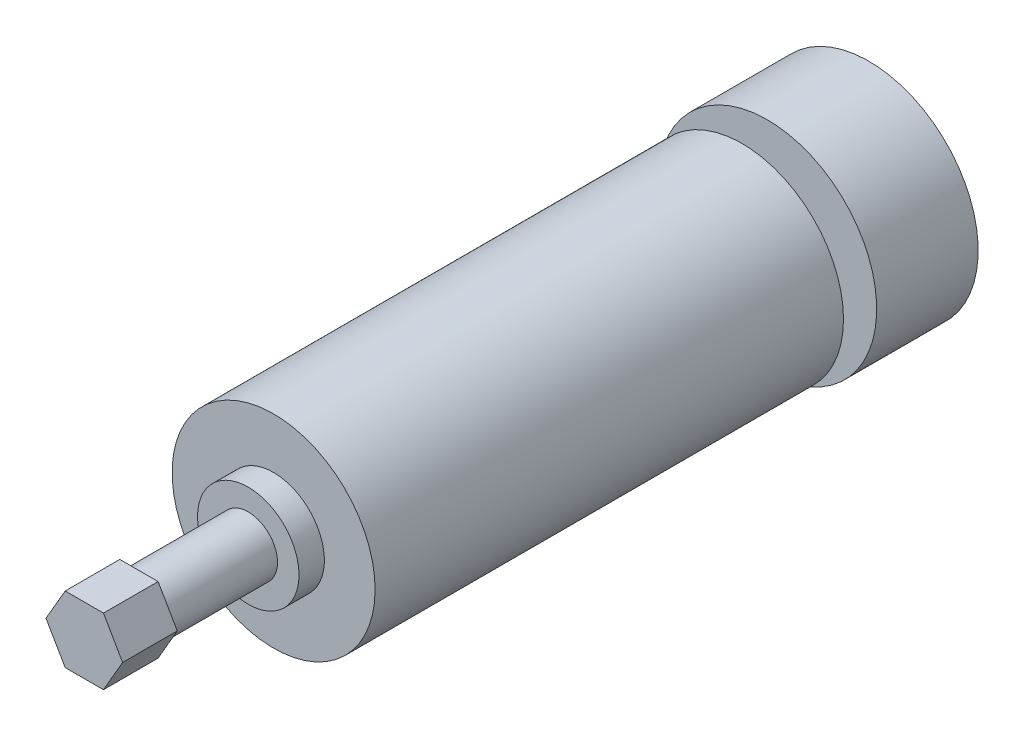
ISO-10303-21;
HEADER;
FILE_DESCRIPTION(('STEP AP214'),'2;1');
FILE_NAME('part.step','',(''),(''),'','','');
FILE_SCHEMA(('AUTOMOTIVE_DESIGN { 1 0 10303 214 1 1 1 1 }'));
ENDSEC;
DATA;
#1=APPLICATION_CONTEXT('core data for automotive mechanical design processes');
#2=APPLICATION_PROTOCOL_DEFINITION('international standard','automotive_design',2000,#1);
#3=PRODUCT_CONTEXT('',#1,'mechanical');
#4=PRODUCT('Part','Part','',(#3));
#5=PRODUCT_RELATED_PRODUCT_CATEGORY('part','',(#4));
#6=PRODUCT_DEFINITION_FORMATION('','',#4);
#7=PRODUCT_DEFINITION_CONTEXT('part definition',#1,'design');
#8=PRODUCT_DEFINITION('design','',#6,#7);
#9=PRODUCT_DEFINITION_SHAPE('','',#8);
#10=(LENGTH_UNIT() NAMED_UNIT(*) SI_UNIT(.MILLI.,.METRE.));
#11=(NAMED_UNIT(*) PLANE_ANGLE_UNIT() SI_UNIT($,.RADIAN.));
#12=(NAMED_UNIT(*) SI_UNIT($,.STERADIAN.) SOLID_ANGLE_UNIT());
#13=UNCERTAINTY_MEASURE_WITH_UNIT(LENGTH_MEASURE(1.E-05),#10,'distance_accuracy_value','');
#14=(GEOMETRIC_REPRESENTATION_CONTEXT(3) GLOBAL_UNCERTAINTY_ASSIGNED_CONTEXT((#13)) GLOBAL_UNIT_ASSIGNED_CONTEXT((#10,
#11,#12)) REPRESENTATION_CONTEXT('',''));
#15=CARTESIAN_POINT('',(0.,0.,0.));
#16=DIRECTION('',(0.,0.,1.));
#17=DIRECTION('',(1.,0.,0.));
#18=AXIS2_PLACEMENT_3D('',#15,#16,#17);
#19=CARTESIAN_POINT('',(0.,0.,120.));
#20=DIRECTION('',(0.,0.,-1.));
#21=DIRECTION('',(-1.,0.,0.));
#22=AXIS2_PLACEMENT_3D('',#19,#20,#21);
#23=CYLINDRICAL_SURFACE('',#22,26.);
#24=CARTESIAN_POINT('',(0.,0.,120.));
#25=DIRECTION('',(0.,0.,1.));
#26=DIRECTION('',(1.,0.,0.));
#27=AXIS2_PLACEMENT_3D('',#24,#25,#26);
#28=CIRCLE('',#27,26.);
#29=CARTESIAN_POINT('',(26.,0.,120.));
#30=VERTEX_POINT('',#29);
#31=EDGE_CURVE('E154',#30,#30,#28,.T.);
#32=ORIENTED_EDGE('',*,*,#31,.F.);
#33=EDGE_LOOP('',(#32));
#34=FACE_BOUND('',#33,.T.);
#35=CARTESIAN_POINT('',(0.,0.,0.));
#36=DIRECTION('',(0.,0.,1.));
#37=DIRECTION('',(1.,0.,0.));
#38=AXIS2_PLACEMENT_3D('',#35,#36,#37);
#39=CIRCLE('',#38,26.);
#40=CARTESIAN_POINT('',(26.,0.,0.));
#41=VERTEX_POINT('',#40);
#42=EDGE_CURVE('E37',#41,#41,#39,.T.);
#43=ORIENTED_EDGE('',*,*,#42,.T.);
#44=EDGE_LOOP('',(#43));
#45=FACE_BOUND('',#44,.T.);
#46=ADVANCED_FACE('F34',(#34,#45),#23,.T.);
#47=CARTESIAN_POINT('',(0.,0.,120.));
#48=DIRECTION('',(0.,0.,1.));
#49=DIRECTION('',(1.,0.,0.));
#50=AXIS2_PLACEMENT_3D('',#47,#48,#49);
#51=PLANE('',#50);
#52=CARTESIAN_POINT('',(0.,0.,120.));
#53=DIRECTION('',(0.,0.,1.));
#54=DIRECTION('',(1.,0.,0.));
#55=AXIS2_PLACEMENT_3D('',#52,#53,#54);
#56=CIRCLE('',#55,13.);
#57=CARTESIAN_POINT('',(-13.,0.,120.));
#58=VERTEX_POINT('',#57);
#59=EDGE_CURVE('E150',#58,#58,#56,.T.);
#60=ORIENTED_EDGE('',*,*,#59,.F.);
#61=EDGE_LOOP('',(#60));
#62=FACE_BOUND('',#61,.T.);
#63=ORIENTED_EDGE('',*,*,#31,.T.);
#64=EDGE_LOOP('',(#63));
#65=FACE_BOUND('',#64,.T.);
#66=ADVANCED_FACE('F165',(#62,#65),#51,.T.);
#67=CARTESIAN_POINT('',(0.,0.,0.));
#68=DIRECTION('',(0.,0.,1.));
#69=DIRECTION('',(1.,0.,0.));
#70=AXIS2_PLACEMENT_3D('',#67,#68,#69);
#71=PLANE('',#70);
#72=CARTESIAN_POINT('',(0.,0.,0.));
#73=DIRECTION('',(0.,0.,-1.));
#74=DIRECTION('',(-1.,0.,0.));
#75=AXIS2_PLACEMENT_3D('',#72,#73,#74);
#76=CIRCLE('',#75,13.);
#77=CARTESIAN_POINT('',(13.,0.,0.));
#78=VERTEX_POINT('',#77);
#79=EDGE_CURVE('E43',#78,#78,#76,.T.);
#80=ORIENTED_EDGE('',*,*,#79,.F.);
#81=EDGE_LOOP('',(#80));
#82=FACE_BOUND('',#81,.T.);
#83=ORIENTED_EDGE('',*,*,#42,.F.);
#84=EDGE_LOOP('',(#83));
#85=FACE_BOUND('',#84,.T.);
#86=ADVANCED_FACE('F162',(#82,#85),#71,.F.);
#87=CARTESIAN_POINT('',(0.,0.,126.5));
#88=DIRECTION('',(0.,0.,-1.));
#89=DIRECTION('',(-1.,0.,0.));
#90=AXIS2_PLACEMENT_3D('',#87,#88,#89);
#91=CYLINDRICAL_SURFACE('',#90,13.);
#92=CARTESIAN_POINT('',(0.,0.,126.5));
#93=DIRECTION('',(0.,0.,1.));
#94=DIRECTION('',(1.,0.,0.));
#95=AXIS2_PLACEMENT_3D('',#92,#93,#94);
#96=CIRCLE('',#95,13.);
#97=CARTESIAN_POINT('',(-13.,0.,126.5));
#98=VERTEX_POINT('',#97);
#99=EDGE_CURVE('E147',#98,#98,#96,.T.);
#100=CARTESIAN_POINT('',(-13.,0.,126.5));
#101=CARTESIAN_POINT('',(-13.,0.,126.432291666667));
#102=CARTESIAN_POINT('',(-13.,0.,126.364583333333));
#103=CARTESIAN_POINT('',(-13.,0.,126.229166666667));
#104=CARTESIAN_POINT('',(-13.,0.,126.161458333333));
#105=CARTESIAN_POINT('',(-13.,0.,126.026041666667));
#106=CARTESIAN_POINT('',(-13.,0.,125.958333333333));
#107=CARTESIAN_POINT('',(-13.,0.,125.822916666667));
#108=CARTESIAN_POINT('',(-13.,0.,125.755208333333));
#109=CARTESIAN_POINT('',(-13.,0.,125.619791666667));
#110=CARTESIAN_POINT('',(-13.,0.,125.552083333333));
#111=CARTESIAN_POINT('',(-13.,0.,125.416666666667));
#112=CARTESIAN_POINT('',(-13.,0.,125.348958333333));
#113=CARTESIAN_POINT('',(-13.,0.,125.213541666667));
#114=CARTESIAN_POINT('',(-13.,0.,125.145833333333));
#115=CARTESIAN_POINT('',(-13.,0.,125.010416666667));
#116=CARTESIAN_POINT('',(-13.,0.,124.942708333333));
#117=CARTESIAN_POINT('',(-13.,0.,124.807291666667));
#118=CARTESIAN_POINT('',(-13.,0.,124.739583333333));
#119=CARTESIAN_POINT('',(-13.,0.,124.604166666667));
#120=CARTESIAN_POINT('',(-13.,0.,124.536458333333));
#121=CARTESIAN_POINT('',(-13.,0.,124.401041666667));
#122=CARTESIAN_POINT('',(-13.,0.,124.333333333333));
#123=CARTESIAN_POINT('',(-13.,0.,124.197916666667));
#124=CARTESIAN_POINT('',(-13.,0.,124.130208333333));
#125=CARTESIAN_POINT('',(-13.,0.,123.994791666667));
#126=CARTESIAN_POINT('',(-13.,0.,123.927083333333));
#127=CARTESIAN_POINT('',(-13.,0.,123.791666666667));
#128=CARTESIAN_POINT('',(-13.,0.,123.723958333333));
#129=CARTESIAN_POINT('',(-13.,0.,123.588541666667));
#130=CARTESIAN_POINT('',(-13.,0.,123.520833333333));
#131=CARTESIAN_POINT('',(-13.,0.,123.385416666667));
#132=CARTESIAN_POINT('',(-13.,0.,123.317708333333));
#133=CARTESIAN_POINT('',(-13.,0.,123.182291666667));
#134=CARTESIAN_POINT('',(-13.,0.,123.114583333333));
#135=CARTESIAN_POINT('',(-13.,0.,122.979166666667));
#136=CARTESIAN_POINT('',(-13.,0.,122.911458333333));
#137=CARTESIAN_POINT('',(-13.,0.,122.776041666667));
#138=CARTESIAN_POINT('',(-13.,0.,122.708333333333));
#139=CARTESIAN_POINT('',(-13.,0.,122.572916666667));
#140=CARTESIAN_POINT('',(-13.,0.,122.505208333333));
#141=CARTESIAN_POINT('',(-13.,0.,122.369791666667));
#142=CARTESIAN_POINT('',(-13.,0.,122.302083333333));
#143=CARTESIAN_POINT('',(-13.,0.,122.166666666667));
#144=CARTESIAN_POINT('',(-13.,0.,122.098958333333));
#145=CARTESIAN_POINT('',(-13.,0.,121.963541666667));
#146=CARTESIAN_POINT('',(-13.,0.,121.895833333333));
#147=CARTESIAN_POINT('',(-13.,0.,121.760416666667));
#148=CARTESIAN_POINT('',(-13.,0.,121.692708333333));
#149=CARTESIAN_POINT('',(-13.,0.,121.557291666667));
#150=CARTESIAN_POINT('',(-13.,0.,121.489583333333));
#151=CARTESIAN_POINT('',(-13.,0.,121.354166666667));
#152=CARTESIAN_POINT('',(-13.,0.,121.286458333333));
#153=CARTESIAN_POINT('',(-13.,0.,121.151041666667));
#154=CARTESIAN_POINT('',(-13.,0.,121.083333333333));
#155=CARTESIAN_POINT('',(-13.,0.,120.947916666667));
#156=CARTESIAN_POINT('',(-13.,0.,120.880208333333));
#157=CARTESIAN_POINT('',(-13.,0.,120.744791666667));
#158=CARTESIAN_POINT('',(-13.,0.,120.677083333333));
#159=CARTESIAN_POINT('',(-13.,0.,120.541666666667));
#160=CARTESIAN_POINT('',(-13.,0.,120.473958333333));
#161=CARTESIAN_POINT('',(-13.,0.,120.338541666667));
#162=CARTESIAN_POINT('',(-13.,0.,120.270833333333));
#163=CARTESIAN_POINT('',(-13.,0.,120.135416666667));
#164=CARTESIAN_POINT('',(-13.,0.,120.067708333333));
#165=CARTESIAN_POINT('',(-13.,0.,120.));
#166=B_SPLINE_CURVE_WITH_KNOTS('',3,(#100,#101,#102,#103,#104,#105,#106,#107,#108,#109,#110,
#111,#112,#113,#114,#115,#116,#117,#118,#119,#120,#121,#122,#123,#124,#125,#126,#127,#128,#129,
#130,#131,#132,#133,#134,#135,#136,#137,#138,#139,#140,#141,#142,#143,#144,#145,#146,#147,#148,
#149,#150,#151,#152,#153,#154,#155,#156,#157,#158,#159,#160,#161,#162,#163,#164,#165),
.UNSPECIFIED.,.F.,.F.,(4,2,2,2,2,2,2,2,2,2,2,2,2,2,2,2,2,2,2,2,2,2,2,2,2,2,2,2,2,2,2,2,4),(0.,
0.203124999999998,0.406249999999997,0.609374999999995,0.812499999999994,1.01562499999999,
1.21874999999999,1.42187499999999,1.62499999999999,1.82812499999999,2.03124999999998,
2.23437499999998,2.43749999999998,2.64062499999998,2.84374999999999,3.04687499999999,
3.24999999999999,3.45312499999999,3.65624999999999,3.85937499999998,4.06249999999998,
4.26562499999998,4.46874999999998,4.67187499999999,4.87499999999999,5.07812499999999,
5.28124999999999,5.48437499999999,5.68749999999998,5.89062499999998,6.09374999999998,
6.29687499999998,6.49999999999999),.UNSPECIFIED.);
#167=EDGE_CURVE('BSEAM164',#98,#58,#166,.T.);
#168=ORIENTED_EDGE('',*,*,#99,.F.);
#169=ORIENTED_EDGE('',*,*,#59,.T.);
#170=ORIENTED_EDGE('',*,*,#167,.T.);
#171=ORIENTED_EDGE('',*,*,#167,.F.);
#172=EDGE_LOOP('',(#168,#170,#169,#171));
#173=FACE_BOUND('',#172,.T.);
#174=ADVANCED_FACE('F164',(#173),#91,.T.);
#175=CARTESIAN_POINT('',(0.,0.,126.5));
#176=DIRECTION('',(0.,0.,1.));
#177=DIRECTION('',(1.,0.,0.));
#178=AXIS2_PLACEMENT_3D('',#175,#176,#177);
#179=PLANE('',#178);
#180=CARTESIAN_POINT('',(0.,0.,126.5));
#181=DIRECTION('',(0.,0.,1.));
#182=DIRECTION('',(1.,0.,0.));
#183=AXIS2_PLACEMENT_3D('',#180,#181,#182);
#184=CIRCLE('',#183,7.5);
#185=CARTESIAN_POINT('',(7.5,0.,126.5));
#186=VERTEX_POINT('',#185);
#187=EDGE_CURVE('E11',#186,#186,#184,.T.);
#188=ORIENTED_EDGE('',*,*,#187,.F.);
#189=EDGE_LOOP('',(#188));
#190=FACE_BOUND('',#189,.T.);
#191=ORIENTED_EDGE('',*,*,#99,.T.);
#192=EDGE_LOOP('',(#191));
#193=FACE_BOUND('',#192,.T.);
#194=ADVANCED_FACE('F171',(#190,#193),#179,.T.);
#195=CARTESIAN_POINT('',(0.,0.,-6.5));
#196=DIRECTION('',(0.,0.,1.));
#197=DIRECTION('',(1.,0.,0.));
#198=AXIS2_PLACEMENT_3D('',#195,#196,#197);
#199=CYLINDRICAL_SURFACE('',#198,13.);
#200=CARTESIAN_POINT('',(0.,0.,-6.5));
#201=DIRECTION('',(0.,0.,-1.));
#202=DIRECTION('',(-1.,0.,0.));
#203=AXIS2_PLACEMENT_3D('',#200,#201,#202);
#204=CIRCLE('',#203,13.);
#205=CARTESIAN_POINT('',(13.,0.,-6.5));
#206=VERTEX_POINT('',#205);
#207=EDGE_CURVE('E143',#206,#206,#204,.T.);
#208=CARTESIAN_POINT('',(13.,0.,-6.5));
#209=CARTESIAN_POINT('',(13.,0.,-6.43229166666667));
#210=CARTESIAN_POINT('',(13.,0.,-6.36458333333333));
#211=CARTESIAN_POINT('',(13.,0.,-6.22916666666667));
#212=CARTESIAN_POINT('',(13.,0.,-6.16145833333333));
#213=CARTESIAN_POINT('',(13.,0.,-6.02604166666667));
#214=CARTESIAN_POINT('',(13.,0.,-5.95833333333333));
#215=CARTESIAN_POINT('',(13.,0.,-5.82291666666667));
#216=CARTESIAN_POINT('',(13.,0.,-5.75520833333333));
#217=CARTESIAN_POINT('',(13.,0.,-5.61979166666667));
#218=CARTESIAN_POINT('',(13.,0.,-5.55208333333333));
#219=CARTESIAN_POINT('',(13.,0.,-5.41666666666667));
#220=CARTESIAN_POINT('',(13.,0.,-5.34895833333333));
#221=CARTESIAN_POINT('',(13.,0.,-5.21354166666667));
#222=CARTESIAN_POINT('',(13.,0.,-5.14583333333333));
#223=CARTESIAN_POINT('',(13.,0.,-5.01041666666667));
#224=CARTESIAN_POINT('',(13.,0.,-4.94270833333333));
#225=CARTESIAN_POINT('',(13.,0.,-4.80729166666667));
#226=CARTESIAN_POINT('',(13.,0.,-4.73958333333333));
#227=CARTESIAN_POINT('',(13.,0.,-4.60416666666667));
#228=CARTESIAN_POINT('',(13.,0.,-4.53645833333333));
#229=CARTESIAN_POINT('',(13.,0.,-4.40104166666667));
#230=CARTESIAN_POINT('',(13.,0.,-4.33333333333333));
#231=CARTESIAN_POINT('',(13.,0.,-4.19791666666667));
#232=CARTESIAN_POINT('',(13.,0.,-4.13020833333333));
#233=CARTESIAN_POINT('',(13.,0.,-3.99479166666667));
#234=CARTESIAN_POINT('',(13.,0.,-3.92708333333333));
#235=CARTESIAN_POINT('',(13.,0.,-3.79166666666667));
#236=CARTESIAN_POINT('',(13.,0.,-3.72395833333333));
#237=CARTESIAN_POINT('',(13.,0.,-3.58854166666667));
#238=CARTESIAN_POINT('',(13.,0.,-3.52083333333333));
#239=CARTESIAN_POINT('',(13.,0.,-3.38541666666667));
#240=CARTESIAN_POINT('',(13.,0.,-3.31770833333333));
#241=CARTESIAN_POINT('',(13.,0.,-3.18229166666667));
#242=CARTESIAN_POINT('',(13.,0.,-3.11458333333333));
#243=CARTESIAN_POINT('',(13.,0.,-2.97916666666667));
#244=CARTESIAN_POINT('',(13.,0.,-2.91145833333333));
#245=CARTESIAN_POINT('',(13.,0.,-2.77604166666667));
#246=CARTESIAN_POINT('',(13.,0.,-2.70833333333333));
#247=CARTESIAN_POINT('',(13.,0.,-2.57291666666667));
#248=CARTESIAN_POINT('',(13.,0.,-2.50520833333333));
#249=CARTESIAN_POINT('',(13.,0.,-2.36979166666667));
#250=CARTESIAN_POINT('',(13.,0.,-2.30208333333333));
#251=CARTESIAN_POINT('',(13.,0.,-2.16666666666667));
#252=CARTESIAN_POINT('',(13.,0.,-2.09895833333333));
#253=CARTESIAN_POINT('',(13.,0.,-1.96354166666667));
#254=CARTESIAN_POINT('',(13.,0.,-1.89583333333333));
#255=CARTESIAN_POINT('',(13.,0.,-1.76041666666667));
#256=CARTESIAN_POINT('',(13.,0.,-1.69270833333333));
#257=CARTESIAN_POINT('',(13.,0.,-1.55729166666667));
#258=CARTESIAN_POINT('',(13.,0.,-1.48958333333333));
#259=CARTESIAN_POINT('',(13.,0.,-1.35416666666667));
#260=CARTESIAN_POINT('',(13.,0.,-1.28645833333333));
#261=CARTESIAN_POINT('',(13.,0.,-1.15104166666667));
#262=CARTESIAN_POINT('',(13.,0.,-1.08333333333333));
#263=CARTESIAN_POINT('',(13.,0.,-0.947916666666667));
#264=CARTESIAN_POINT('',(13.,0.,-0.880208333333333));
#265=CARTESIAN_POINT('',(13.,0.,-0.744791666666667));
#266=CARTESIAN_POINT('',(13.,0.,-0.677083333333333));
#267=CARTESIAN_POINT('',(13.,0.,-0.541666666666667));
#268=CARTESIAN_POINT('',(13.,0.,-0.473958333333333));
#269=CARTESIAN_POINT('',(13.,0.,-0.338541666666667));
#270=CARTESIAN_POINT('',(13.,0.,-0.270833333333334));
#271=CARTESIAN_POINT('',(13.,0.,-0.135416666666667));
#272=CARTESIAN_POINT('',(13.,0.,-0.0677083333333334));
#273=CARTESIAN_POINT('',(13.,0.,0.));
#274=B_SPLINE_CURVE_WITH_KNOTS('',3,(#208,#209,#210,#211,#212,#213,#214,#215,#216,#217,#218,
#219,#220,#221,#222,#223,#224,#225,#226,#227,#228,#229,#230,#231,#232,#233,#234,#235,#236,#237,
#238,#239,#240,#241,#242,#243,#244,#245,#246,#247,#248,#249,#250,#251,#252,#253,#254,#255,#256,
#257,#258,#259,#260,#261,#262,#263,#264,#265,#266,#267,#268,#269,#270,#271,#272,#273),
.UNSPECIFIED.,.F.,.F.,(4,2,2,2,2,2,2,2,2,2,2,2,2,2,2,2,2,2,2,2,2,2,2,2,2,2,2,2,2,2,2,2,4),(0.,
0.203125,0.40625,0.609375000000001,0.812500000000001,1.015625,1.21875,1.421875,1.625,1.828125,
2.03125,2.234375,2.4375,2.640625,2.84375,3.046875,3.25,3.453125,3.65625,3.859375,4.0625,
4.265625,4.46875,4.671875,4.875,5.078125,5.28125,5.484375,5.6875,5.890625,6.09375,6.296875,6.5),.UNSPECIFIED.);
#275=EDGE_CURVE('BSEAM202',#206,#78,#274,.T.);
#276=ORIENTED_EDGE('',*,*,#207,.F.);
#277=ORIENTED_EDGE('',*,*,#79,.T.);
#278=ORIENTED_EDGE('',*,*,#275,.T.);
#279=ORIENTED_EDGE('',*,*,#275,.F.);
#280=EDGE_LOOP('',(#276,#278,#277,#279));
#281=FACE_BOUND('',#280,.T.);
#282=ADVANCED_FACE('F202',(#281),#199,.T.);
#283=CARTESIAN_POINT('',(0.,0.,154.5));
#284=DIRECTION('',(0.,0.,-1.));
#285=DIRECTION('',(-1.,0.,0.));
#286=AXIS2_PLACEMENT_3D('',#283,#284,#285);
#287=CYLINDRICAL_SURFACE('',#286,7.5);
#288=CARTESIAN_POINT('',(0.,0.,154.5));
#289=DIRECTION('',(0.,0.,1.));
#290=DIRECTION('',(1.,0.,0.));
#291=AXIS2_PLACEMENT_3D('',#288,#289,#290);
#292=CIRCLE('',#291,7.5);
#293=CARTESIAN_POINT('',(7.5,0.,154.5));
#294=VERTEX_POINT('',#293);
#295=EDGE_CURVE('E141',#294,#294,#292,.T.);
#296=ORIENTED_EDGE('',*,*,#295,.F.);
#297=EDGE_LOOP('',(#296));
#298=FACE_BOUND('',#297,.T.);
#299=ORIENTED_EDGE('',*,*,#187,.T.);
#300=EDGE_LOOP('',(#299));
#301=FACE_BOUND('',#300,.T.);
#302=ADVANCED_FACE('F207',(#298,#301),#287,.T.);
#303=CARTESIAN_POINT('',(4.90747728811182,-8.50000000000001,168.5));
#304=DIRECTION('',(-0.866025403784439,0.5,0.));
#305=DIRECTION('',(-0.5,-0.866025403784439,0.));
#306=AXIS2_PLACEMENT_3D('',#303,#304,#305);
#307=PLANE('',#306);
#308=DIRECTION('',(0.5,0.866025403784439,0.));
#309=VECTOR('',#308,1.);
#310=CARTESIAN_POINT('',(4.90747728811182,-8.50000000000001,154.5));
#311=LINE('',#310,#309);
#312=CARTESIAN_POINT('',(4.90747728811182,-8.50000000000001,154.5));
#313=VERTEX_POINT('',#312);
#314=CARTESIAN_POINT('',(9.81495457622364,0.,154.5));
#315=VERTEX_POINT('',#314);
#316=EDGE_CURVE('E121',#313,#315,#311,.T.);
#317=ORIENTED_EDGE('',*,*,#316,.T.);
#318=DIRECTION('',(0.,0.,-1.));
#319=VECTOR('',#318,1.);
#320=CARTESIAN_POINT('',(9.81495457622364,0.,168.5));
#321=LINE('',#320,#319);
#322=CARTESIAN_POINT('',(9.81495457622364,0.,168.5));
#323=VERTEX_POINT('',#322);
#324=EDGE_CURVE('E139',#323,#315,#321,.T.);
#325=ORIENTED_EDGE('',*,*,#324,.F.);
#326=DIRECTION('',(0.5,0.866025403784439,0.));
#327=VECTOR('',#326,1.);
#328=CARTESIAN_POINT('',(4.90747728811182,-8.50000000000001,168.5));
#329=LINE('',#328,#327);
#330=CARTESIAN_POINT('',(4.90747728811182,-8.50000000000001,168.5));
#331=VERTEX_POINT('',#330);
#332=EDGE_CURVE('E132',#331,#323,#329,.T.);
#333=ORIENTED_EDGE('',*,*,#332,.F.);
#334=DIRECTION('',(0.,0.,-1.));
#335=VECTOR('',#334,1.);
#336=CARTESIAN_POINT('',(4.90747728811182,-8.50000000000001,168.5));
#337=LINE('',#336,#335);
#338=EDGE_CURVE('E117',#331,#313,#337,.T.);
#339=ORIENTED_EDGE('',*,*,#338,.T.);
#340=EDGE_LOOP('',(#317,#325,#333,#339));
#341=FACE_BOUND('',#340,.T.);
#342=ADVANCED_FACE('F224',(#341),#307,.F.);
#343=CARTESIAN_POINT('',(9.81495457622364,0.,168.5));
#344=DIRECTION('',(-0.866025403784438,-0.5,0.));
#345=DIRECTION('',(0.5,-0.866025403784438,0.));
#346=AXIS2_PLACEMENT_3D('',#343,#344,#345);
#347=PLANE('',#346);
#348=DIRECTION('',(-0.5,0.866025403784438,0.));
#349=VECTOR('',#348,1.);
#350=CARTESIAN_POINT('',(9.81495457622364,0.,154.5));
#351=LINE('',#350,#349);
#352=CARTESIAN_POINT('',(4.90747728811181,8.50000000000001,154.5));
#353=VERTEX_POINT('',#352);
#354=EDGE_CURVE('E124',#315,#353,#351,.T.);
#355=ORIENTED_EDGE('',*,*,#354,.T.);
#356=DIRECTION('',(0.,0.,-1.));
#357=VECTOR('',#356,1.);
#358=CARTESIAN_POINT('',(4.90747728811181,8.50000000000001,168.5));
#359=LINE('',#358,#357);
#360=CARTESIAN_POINT('',(4.90747728811181,8.50000000000001,168.5));
#361=VERTEX_POINT('',#360);
#362=EDGE_CURVE('E136',#361,#353,#359,.T.);
#363=ORIENTED_EDGE('',*,*,#362,.F.);
#364=DIRECTION('',(-0.5,0.866025403784438,0.));
#365=VECTOR('',#364,1.);
#366=CARTESIAN_POINT('',(9.81495457622364,0.,168.5));
#367=LINE('',#366,#365);
#368=EDGE_CURVE('E90',#323,#361,#367,.T.);
#369=ORIENTED_EDGE('',*,*,#368,.F.);
#370=ORIENTED_EDGE('',*,*,#324,.T.);
#371=EDGE_LOOP('',(#355,#363,#369,#370));
#372=FACE_BOUND('',#371,.T.);
#373=ADVANCED_FACE('F234',(#372),#347,.F.);
#374=CARTESIAN_POINT('',(4.90747728811181,8.50000000000001,168.5));
#375=DIRECTION('',(0.,-1.,0.));
#376=DIRECTION('',(0.,0.,-1.));
#377=AXIS2_PLACEMENT_3D('',#374,#375,#376);
#378=PLANE('',#377);
#379=DIRECTION('',(-1.,0.,0.));
#380=VECTOR('',#379,1.);
#381=CARTESIAN_POINT('',(4.90747728811181,8.50000000000001,154.5));
#382=LINE('',#381,#380);
#383=CARTESIAN_POINT('',(-4.90747728811182,8.50000000000001,154.5));
#384=VERTEX_POINT('',#383);
#385=EDGE_CURVE('E127',#353,#384,#382,.T.);
#386=ORIENTED_EDGE('',*,*,#385,.T.);
#387=DIRECTION('',(0.,0.,-1.));
#388=VECTOR('',#387,1.);
#389=CARTESIAN_POINT('',(-4.90747728811182,8.50000000000001,168.5));
#390=LINE('',#389,#388);
#391=CARTESIAN_POINT('',(-4.90747728811182,8.50000000000001,168.5));
#392=VERTEX_POINT('',#391);
#393=EDGE_CURVE('E112',#392,#384,#390,.T.);
#394=ORIENTED_EDGE('',*,*,#393,.F.);
#395=DIRECTION('',(-1.,0.,0.));
#396=VECTOR('',#395,1.);
#397=CARTESIAN_POINT('',(4.90747728811181,8.50000000000001,168.5));
#398=LINE('',#397,#396);
#399=EDGE_CURVE('E103',#361,#392,#398,.T.);
#400=ORIENTED_EDGE('',*,*,#399,.F.);
#401=ORIENTED_EDGE('',*,*,#362,.T.);
#402=EDGE_LOOP('',(#386,#394,#400,#401));
#403=FACE_BOUND('',#402,.T.);
#404=ADVANCED_FACE('F244',(#403),#378,.F.);
#405=CARTESIAN_POINT('',(-4.90747728811182,8.50000000000001,168.5));
#406=DIRECTION('',(0.866025403784439,-0.5,0.));
#407=DIRECTION('',(0.5,0.866025403784439,0.));
#408=AXIS2_PLACEMENT_3D('',#405,#406,#407);
#409=PLANE('',#408);
#410=DIRECTION('',(-0.5,-0.866025403784439,0.));
#411=VECTOR('',#410,1.);
#412=CARTESIAN_POINT('',(-4.90747728811182,8.50000000000001,154.5));
#413=LINE('',#412,#411);
#414=CARTESIAN_POINT('',(-9.81495457622364,0.,154.5));
#415=VERTEX_POINT('',#414);
#416=EDGE_CURVE('E111',#384,#415,#413,.T.);
#417=ORIENTED_EDGE('',*,*,#416,.T.);
#418=DIRECTION('',(0.,0.,-1.));
#419=VECTOR('',#418,1.);
#420=CARTESIAN_POINT('',(-9.81495457622364,0.,168.5));
#421=LINE('',#420,#419);
#422=CARTESIAN_POINT('',(-9.81495457622364,0.,168.5));
#423=VERTEX_POINT('',#422);
#424=EDGE_CURVE('E108',#423,#415,#421,.T.);
#425=ORIENTED_EDGE('',*,*,#424,.F.);
#426=DIRECTION('',(-0.5,-0.866025403784439,0.));
#427=VECTOR('',#426,1.);
#428=CARTESIAN_POINT('',(-4.90747728811182,8.50000000000001,168.5));
#429=LINE('',#428,#427);
#430=EDGE_CURVE('E97',#392,#423,#429,.T.);
#431=ORIENTED_EDGE('',*,*,#430,.F.);
#432=ORIENTED_EDGE('',*,*,#393,.T.);
#433=EDGE_LOOP('',(#417,#425,#431,#432));
#434=FACE_BOUND('',#433,.T.);
#435=ADVANCED_FACE('F109',(#434),#409,.F.);
#436=CARTESIAN_POINT('',(-9.81495457622364,0.,168.5));
#437=DIRECTION('',(0.866025403784438,0.5,0.));
#438=DIRECTION('',(-0.5,0.866025403784439,0.));
#439=AXIS2_PLACEMENT_3D('',#436,#437,#438);
#440=PLANE('',#439);
#441=DIRECTION('',(0.5,-0.866025403784438,0.));
#442=VECTOR('',#441,1.);
#443=CARTESIAN_POINT('',(-9.81495457622364,0.,154.5));
#444=LINE('',#443,#442);
#445=CARTESIAN_POINT('',(-4.90747728811182,-8.50000000000001,154.5));
#446=VERTEX_POINT('',#445);
#447=EDGE_CURVE('E75',#415,#446,#444,.T.);
#448=ORIENTED_EDGE('',*,*,#447,.T.);
#449=DIRECTION('',(0.,0.,-1.));
#450=VECTOR('',#449,1.);
#451=CARTESIAN_POINT('',(-4.90747728811182,-8.50000000000001,168.5));
#452=LINE('',#451,#450);
#453=CARTESIAN_POINT('',(-4.90747728811182,-8.50000000000001,168.5));
#454=VERTEX_POINT('',#453);
#455=EDGE_CURVE('E113',#454,#446,#452,.T.);
#456=ORIENTED_EDGE('',*,*,#455,.F.);
#457=DIRECTION('',(0.5,-0.866025403784438,0.));
#458=VECTOR('',#457,1.);
#459=CARTESIAN_POINT('',(-9.81495457622364,0.,168.5));
#460=LINE('',#459,#458);
#461=EDGE_CURVE('E101',#423,#454,#460,.T.);
#462=ORIENTED_EDGE('',*,*,#461,.F.);
#463=ORIENTED_EDGE('',*,*,#424,.T.);
#464=EDGE_LOOP('',(#448,#456,#462,#463));
#465=FACE_BOUND('',#464,.T.);
#466=ADVANCED_FACE('F115',(#465),#440,.F.);
#467=CARTESIAN_POINT('',(-4.90747728811182,-8.50000000000001,168.5));
#468=DIRECTION('',(0.,1.,0.));
#469=DIRECTION('',(-1.,0.,0.));
#470=AXIS2_PLACEMENT_3D('',#467,#468,#469);
#471=PLANE('',#470);
#472=DIRECTION('',(1.,0.,0.));
#473=VECTOR('',#472,1.);
#474=CARTESIAN_POINT('',(-4.90747728811182,-8.50000000000001,154.5));
#475=LINE('',#474,#473);
#476=EDGE_CURVE('E81',#446,#313,#475,.T.);
#477=ORIENTED_EDGE('',*,*,#476,.T.);
#478=ORIENTED_EDGE('',*,*,#338,.F.);
#479=DIRECTION('',(1.,0.,0.));
#480=VECTOR('',#479,1.);
#481=CARTESIAN_POINT('',(-4.90747728811182,-8.50000000000001,168.5));
#482=LINE('',#481,#480);
#483=EDGE_CURVE('E52',#454,#331,#482,.T.);
#484=ORIENTED_EDGE('',*,*,#483,.F.);
#485=ORIENTED_EDGE('',*,*,#455,.T.);
#486=EDGE_LOOP('',(#477,#478,#484,#485));
#487=FACE_BOUND('',#486,.T.);
#488=ADVANCED_FACE('F270',(#487),#471,.F.);
#489=CARTESIAN_POINT('',(0.,0.,168.5));
#490=DIRECTION('',(0.,0.,1.));
#491=DIRECTION('',(1.,0.,0.));
#492=AXIS2_PLACEMENT_3D('',#489,#490,#491);
#493=PLANE('',#492);
#494=ORIENTED_EDGE('',*,*,#332,.T.);
#495=ORIENTED_EDGE('',*,*,#368,.T.);
#496=ORIENTED_EDGE('',*,*,#399,.T.);
#497=ORIENTED_EDGE('',*,*,#430,.T.);
#498=ORIENTED_EDGE('',*,*,#461,.T.);
#499=ORIENTED_EDGE('',*,*,#483,.T.);
#500=EDGE_LOOP('',(#494,#495,#496,#497,#498,#499));
#501=FACE_BOUND('',#500,.T.);
#502=ADVANCED_FACE('F99',(#501),#493,.T.);
#503=CARTESIAN_POINT('',(0.,0.,154.5));
#504=DIRECTION('',(0.,0.,1.));
#505=DIRECTION('',(1.,0.,0.));
#506=AXIS2_PLACEMENT_3D('',#503,#504,#505);
#507=PLANE('',#506);
#508=ORIENTED_EDGE('',*,*,#295,.T.);
#509=EDGE_LOOP('',(#508));
#510=FACE_BOUND('',#509,.T.);
#511=ORIENTED_EDGE('',*,*,#316,.F.);
#512=ORIENTED_EDGE('',*,*,#476,.F.);
#513=ORIENTED_EDGE('',*,*,#447,.F.);
#514=ORIENTED_EDGE('',*,*,#416,.F.);
#515=ORIENTED_EDGE('',*,*,#385,.F.);
#516=ORIENTED_EDGE('',*,*,#354,.F.);
#517=EDGE_LOOP('',(#511,#512,#513,#514,#515,#516));
#518=FACE_BOUND('',#517,.T.);
#519=ADVANCED_FACE('F287',(#510,#518),#507,.F.);
#520=CARTESIAN_POINT('',(0.,0.,-32.5));
#521=DIRECTION('',(0.,0.,1.));
#522=DIRECTION('',(1.,0.,0.));
#523=AXIS2_PLACEMENT_3D('',#520,#521,#522);
#524=CYLINDRICAL_SURFACE('',#523,28.);
#525=CARTESIAN_POINT('',(0.,0.,-32.5));
#526=DIRECTION('',(0.,0.,-1.));
#527=DIRECTION('',(-1.,0.,0.));
#528=AXIS2_PLACEMENT_3D('',#525,#526,#527);
#529=CIRCLE('',#528,28.);
#530=CARTESIAN_POINT('',(-28.,0.,-32.5));
#531=VERTEX_POINT('',#530);
#532=EDGE_CURVE('E125',#531,#531,#529,.T.);
#533=ORIENTED_EDGE('',*,*,#532,.F.);
#534=EDGE_LOOP('',(#533));
#535=FACE_BOUND('',#534,.T.);
#536=CARTESIAN_POINT('',(0.,0.,-6.5));
#537=DIRECTION('',(0.,0.,-1.));
#538=DIRECTION('',(-1.,0.,0.));
#539=AXIS2_PLACEMENT_3D('',#536,#537,#538);
#540=CIRCLE('',#539,28.);
#541=CARTESIAN_POINT('',(-28.,0.,-6.5));
#542=VERTEX_POINT('',#541);
#543=EDGE_CURVE('E334',#542,#542,#540,.T.);
#544=ORIENTED_EDGE('',*,*,#543,.T.);
#545=EDGE_LOOP('',(#544));
#546=FACE_BOUND('',#545,.T.);
#547=ADVANCED_FACE('F296',(#535,#546),#524,.T.);
#548=CARTESIAN_POINT('',(0.,0.,-32.5));
#549=DIRECTION('',(0.,0.,-1.));
#550=DIRECTION('',(-1.,0.,0.));
#551=AXIS2_PLACEMENT_3D('',#548,#549,#550);
#552=PLANE('',#551);
#553=ORIENTED_EDGE('',*,*,#532,.T.);
#554=EDGE_LOOP('',(#553));
#555=FACE_BOUND('',#554,.T.);
#556=ADVANCED_FACE('F306',(#555),#552,.T.);
#557=CARTESIAN_POINT('',(0.,0.,-6.5));
#558=DIRECTION('',(0.,0.,-1.));
#559=DIRECTION('',(-1.,0.,0.));
#560=AXIS2_PLACEMENT_3D('',#557,#558,#559);
#561=PLANE('',#560);
#562=ORIENTED_EDGE('',*,*,#207,.T.);
#563=EDGE_LOOP('',(#562));
#564=FACE_BOUND('',#563,.T.);
#565=ORIENTED_EDGE('',*,*,#543,.F.);
#566=EDGE_LOOP('',(#565));
#567=FACE_BOUND('',#566,.T.);
#568=ADVANCED_FACE('F316',(#564,#567),#561,.F.);
#569=CLOSED_SHELL('',(#46,#66,#86,#174,#194,#282,#302,#342,#373,#404,#435,#466,#488,#502,#519,
#547,#556,#568));
#570=MANIFOLD_SOLID_BREP('B2',#569);
#571=ADVANCED_BREP_SHAPE_REPRESENTATION('',(#18,#570),#14);
#572=SHAPE_DEFINITION_REPRESENTATION(#9,#571);
ENDSEC;
END-ISO-10303-21;
